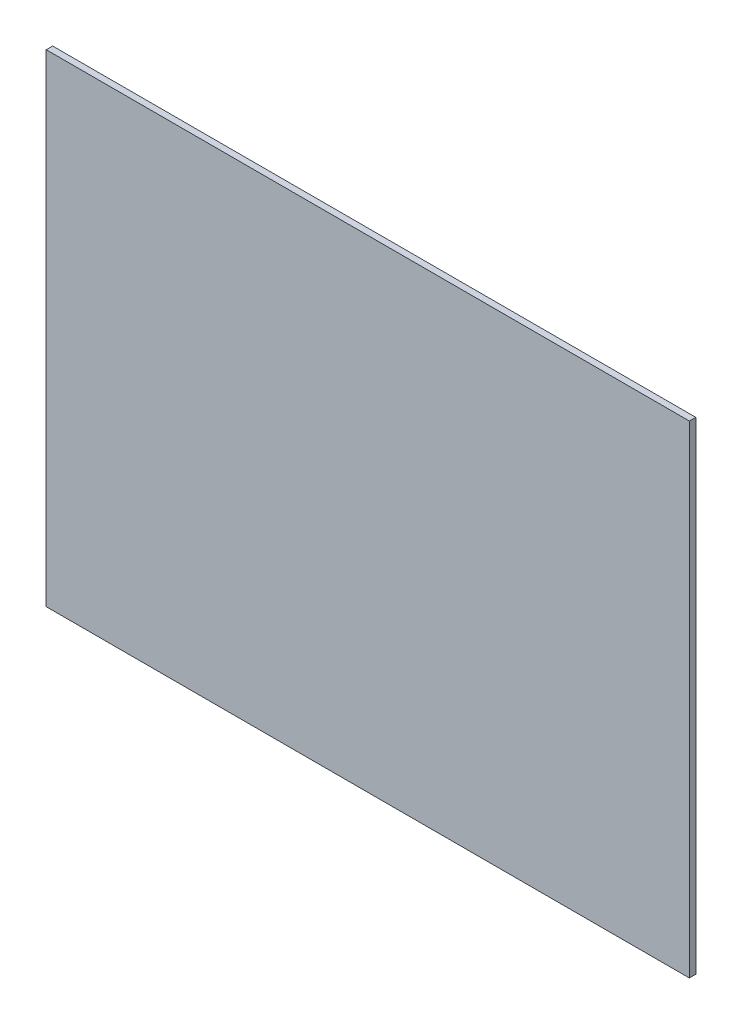
ISO-10303-21;
HEADER;
FILE_DESCRIPTION(('STEP AP214'),'2;1');
FILE_NAME('part.step','',(''),(''),'','','');
FILE_SCHEMA(('AUTOMOTIVE_DESIGN { 1 0 10303 214 1 1 1 1 }'));
ENDSEC;
DATA;
#1=APPLICATION_CONTEXT('core data for automotive mechanical design processes');
#2=APPLICATION_PROTOCOL_DEFINITION('international standard','automotive_design',2000,#1);
#3=PRODUCT_CONTEXT('',#1,'mechanical');
#4=PRODUCT('Part','Part','',(#3));
#5=PRODUCT_RELATED_PRODUCT_CATEGORY('part','',(#4));
#6=PRODUCT_DEFINITION_FORMATION('','',#4);
#7=PRODUCT_DEFINITION_CONTEXT('part definition',#1,'design');
#8=PRODUCT_DEFINITION('design','',#6,#7);
#9=PRODUCT_DEFINITION_SHAPE('','',#8);
#10=(LENGTH_UNIT() NAMED_UNIT(*) SI_UNIT(.MILLI.,.METRE.));
#11=(NAMED_UNIT(*) PLANE_ANGLE_UNIT() SI_UNIT($,.RADIAN.));
#12=(NAMED_UNIT(*) SI_UNIT($,.STERADIAN.) SOLID_ANGLE_UNIT());
#13=UNCERTAINTY_MEASURE_WITH_UNIT(LENGTH_MEASURE(1.E-05),#10,'distance_accuracy_value','');
#14=(GEOMETRIC_REPRESENTATION_CONTEXT(3) GLOBAL_UNCERTAINTY_ASSIGNED_CONTEXT((#13)) GLOBAL_UNIT_ASSIGNED_CONTEXT((#10,
#11,#12)) REPRESENTATION_CONTEXT('',''));
#15=CARTESIAN_POINT('',(0.,0.,0.));
#16=DIRECTION('',(0.,0.,1.));
#17=DIRECTION('',(1.,0.,0.));
#18=AXIS2_PLACEMENT_3D('',#15,#16,#17);
#19=CARTESIAN_POINT('',(0.,150.,2.));
#20=DIRECTION('',(1.,0.,0.));
#21=DIRECTION('',(0.,1.,0.));
#22=AXIS2_PLACEMENT_3D('',#19,#20,#21);
#23=PLANE('',#22);
#24=DIRECTION('',(0.,-1.,0.));
#25=VECTOR('',#24,1.);
#26=CARTESIAN_POINT('',(0.,150.,0.));
#27=LINE('',#26,#25);
#28=CARTESIAN_POINT('',(0.,150.,0.));
#29=VERTEX_POINT('',#28);
#30=CARTESIAN_POINT('',(0.,0.,0.));
#31=VERTEX_POINT('',#30);
#32=EDGE_CURVE('E100',#29,#31,#27,.T.);
#33=ORIENTED_EDGE('',*,*,#32,.T.);
#34=DIRECTION('',(0.,0.,-1.));
#35=VECTOR('',#34,1.);
#36=CARTESIAN_POINT('',(0.,0.,2.));
#37=LINE('',#36,#35);
#38=CARTESIAN_POINT('',(0.,0.,2.));
#39=VERTEX_POINT('',#38);
#40=EDGE_CURVE('E11',#39,#31,#37,.T.);
#41=ORIENTED_EDGE('',*,*,#40,.F.);
#42=DIRECTION('',(0.,-1.,0.));
#43=VECTOR('',#42,1.);
#44=CARTESIAN_POINT('',(0.,150.,2.));
#45=LINE('',#44,#43);
#46=CARTESIAN_POINT('',(0.,150.,2.));
#47=VERTEX_POINT('',#46);
#48=EDGE_CURVE('E88',#47,#39,#45,.T.);
#49=ORIENTED_EDGE('',*,*,#48,.F.);
#50=DIRECTION('',(0.,0.,-1.));
#51=VECTOR('',#50,1.);
#52=CARTESIAN_POINT('',(0.,150.,2.));
#53=LINE('',#52,#51);
#54=EDGE_CURVE('E96',#47,#29,#53,.T.);
#55=ORIENTED_EDGE('',*,*,#54,.T.);
#56=EDGE_LOOP('',(#33,#41,#49,#55));
#57=FACE_BOUND('',#56,.T.);
#58=ADVANCED_FACE('F37',(#57),#23,.F.);
#59=CARTESIAN_POINT('',(0.,0.,2.));
#60=DIRECTION('',(0.,1.,0.));
#61=DIRECTION('',(0.,0.,1.));
#62=AXIS2_PLACEMENT_3D('',#59,#60,#61);
#63=PLANE('',#62);
#64=DIRECTION('',(1.,0.,0.));
#65=VECTOR('',#64,1.);
#66=CARTESIAN_POINT('',(0.,0.,0.));
#67=LINE('',#66,#65);
#68=CARTESIAN_POINT('',(200.,0.,0.));
#69=VERTEX_POINT('',#68);
#70=EDGE_CURVE('E92',#31,#69,#67,.T.);
#71=ORIENTED_EDGE('',*,*,#70,.T.);
#72=DIRECTION('',(0.,0.,-1.));
#73=VECTOR('',#72,1.);
#74=CARTESIAN_POINT('',(200.,0.,2.));
#75=LINE('',#74,#73);
#76=CARTESIAN_POINT('',(200.,0.,2.));
#77=VERTEX_POINT('',#76);
#78=EDGE_CURVE('E45',#77,#69,#75,.T.);
#79=ORIENTED_EDGE('',*,*,#78,.F.);
#80=DIRECTION('',(1.,0.,0.));
#81=VECTOR('',#80,1.);
#82=CARTESIAN_POINT('',(0.,0.,2.));
#83=LINE('',#82,#81);
#84=EDGE_CURVE('E83',#39,#77,#83,.T.);
#85=ORIENTED_EDGE('',*,*,#84,.F.);
#86=ORIENTED_EDGE('',*,*,#40,.T.);
#87=EDGE_LOOP('',(#71,#79,#85,#86));
#88=FACE_BOUND('',#87,.T.);
#89=ADVANCED_FACE('F91',(#88),#63,.F.);
#90=CARTESIAN_POINT('',(200.,0.,2.));
#91=DIRECTION('',(-1.,0.,0.));
#92=DIRECTION('',(0.,0.,1.));
#93=AXIS2_PLACEMENT_3D('',#90,#91,#92);
#94=PLANE('',#93);
#95=DIRECTION('',(0.,1.,0.));
#96=VECTOR('',#95,1.);
#97=CARTESIAN_POINT('',(200.,0.,0.));
#98=LINE('',#97,#96);
#99=CARTESIAN_POINT('',(200.,150.,0.));
#100=VERTEX_POINT('',#99);
#101=EDGE_CURVE('E70',#69,#100,#98,.T.);
#102=ORIENTED_EDGE('',*,*,#101,.T.);
#103=DIRECTION('',(0.,0.,-1.));
#104=VECTOR('',#103,1.);
#105=CARTESIAN_POINT('',(200.,150.,2.));
#106=LINE('',#105,#104);
#107=CARTESIAN_POINT('',(200.,150.,2.));
#108=VERTEX_POINT('',#107);
#109=EDGE_CURVE('E93',#108,#100,#106,.T.);
#110=ORIENTED_EDGE('',*,*,#109,.F.);
#111=DIRECTION('',(0.,1.,0.));
#112=VECTOR('',#111,1.);
#113=CARTESIAN_POINT('',(200.,0.,2.));
#114=LINE('',#113,#112);
#115=EDGE_CURVE('E86',#77,#108,#114,.T.);
#116=ORIENTED_EDGE('',*,*,#115,.F.);
#117=ORIENTED_EDGE('',*,*,#78,.T.);
#118=EDGE_LOOP('',(#102,#110,#116,#117));
#119=FACE_BOUND('',#118,.T.);
#120=ADVANCED_FACE('F94',(#119),#94,.F.);
#121=CARTESIAN_POINT('',(200.,150.,2.));
#122=DIRECTION('',(0.,-1.,0.));
#123=DIRECTION('',(1.,0.,0.));
#124=AXIS2_PLACEMENT_3D('',#121,#122,#123);
#125=PLANE('',#124);
#126=DIRECTION('',(-1.,0.,0.));
#127=VECTOR('',#126,1.);
#128=CARTESIAN_POINT('',(200.,150.,0.));
#129=LINE('',#128,#127);
#130=EDGE_CURVE('E76',#100,#29,#129,.T.);
#131=ORIENTED_EDGE('',*,*,#130,.T.);
#132=ORIENTED_EDGE('',*,*,#54,.F.);
#133=DIRECTION('',(-1.,0.,0.));
#134=VECTOR('',#133,1.);
#135=CARTESIAN_POINT('',(200.,150.,2.));
#136=LINE('',#135,#134);
#137=EDGE_CURVE('E53',#108,#47,#136,.T.);
#138=ORIENTED_EDGE('',*,*,#137,.F.);
#139=ORIENTED_EDGE('',*,*,#109,.T.);
#140=EDGE_LOOP('',(#131,#132,#138,#139));
#141=FACE_BOUND('',#140,.T.);
#142=ADVANCED_FACE('F107',(#141),#125,.F.);
#143=CARTESIAN_POINT('',(0.,0.,2.));
#144=DIRECTION('',(0.,0.,1.));
#145=DIRECTION('',(1.,0.,0.));
#146=AXIS2_PLACEMENT_3D('',#143,#144,#145);
#147=PLANE('',#146);
#148=ORIENTED_EDGE('',*,*,#48,.T.);
#149=ORIENTED_EDGE('',*,*,#84,.T.);
#150=ORIENTED_EDGE('',*,*,#115,.T.);
#151=ORIENTED_EDGE('',*,*,#137,.T.);
#152=EDGE_LOOP('',(#148,#149,#150,#151));
#153=FACE_BOUND('',#152,.T.);
#154=ADVANCED_FACE('F84',(#153),#147,.T.);
#155=CARTESIAN_POINT('',(0.,0.,0.));
#156=DIRECTION('',(0.,0.,1.));
#157=DIRECTION('',(1.,0.,0.));
#158=AXIS2_PLACEMENT_3D('',#155,#156,#157);
#159=PLANE('',#158);
#160=ORIENTED_EDGE('',*,*,#32,.F.);
#161=ORIENTED_EDGE('',*,*,#130,.F.);
#162=ORIENTED_EDGE('',*,*,#101,.F.);
#163=ORIENTED_EDGE('',*,*,#70,.F.);
#164=EDGE_LOOP('',(#160,#161,#162,#163));
#165=FACE_BOUND('',#164,.T.);
#166=ADVANCED_FACE('F110',(#165),#159,.F.);
#167=CLOSED_SHELL('',(#58,#89,#120,#142,#154,#166));
#168=MANIFOLD_SOLID_BREP('B2',#167);
#169=ADVANCED_BREP_SHAPE_REPRESENTATION('',(#18,#168),#14);
#170=SHAPE_DEFINITION_REPRESENTATION(#9,#169);
ENDSEC;
END-ISO-10303-21;
